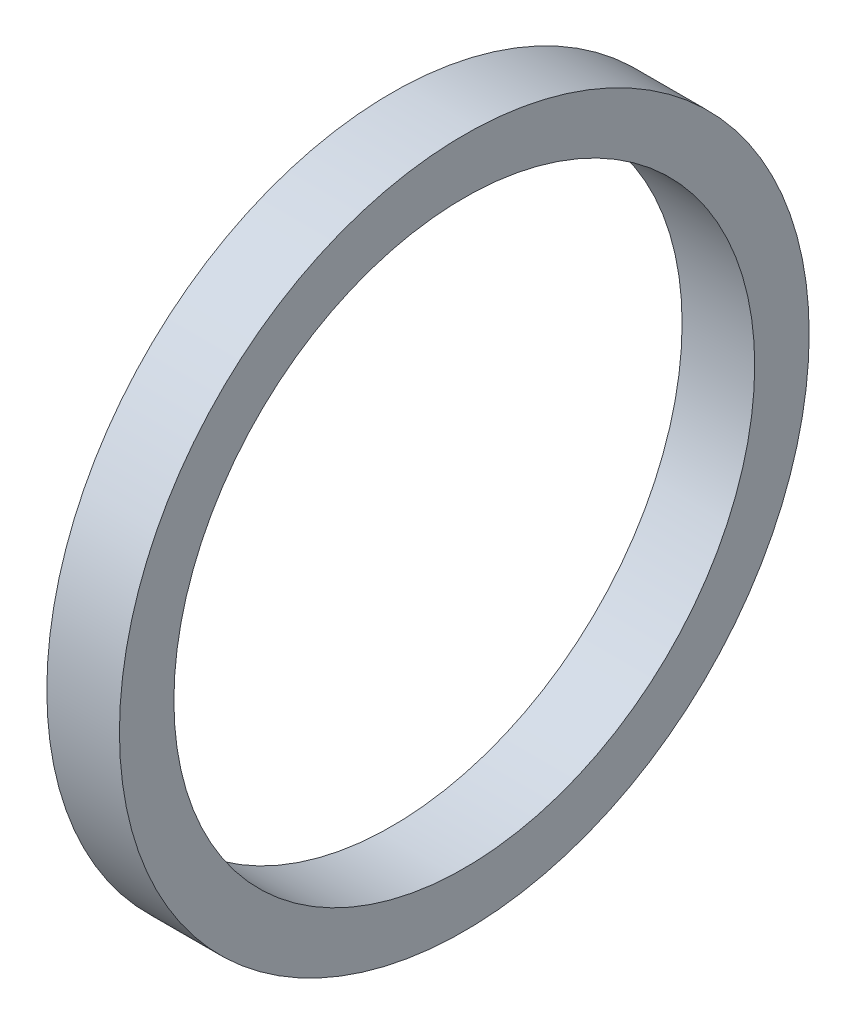
ISO-10303-21;
HEADER;
FILE_DESCRIPTION(('STEP AP214'),'2;1');
FILE_NAME('part.step','',(''),(''),'','','');
FILE_SCHEMA(('AUTOMOTIVE_DESIGN { 1 0 10303 214 1 1 1 1 }'));
ENDSEC;
DATA;
#1=APPLICATION_CONTEXT('core data for automotive mechanical design processes');
#2=APPLICATION_PROTOCOL_DEFINITION('international standard','automotive_design',2000,#1);
#3=PRODUCT_CONTEXT('',#1,'mechanical');
#4=PRODUCT('Part','Part','',(#3));
#5=PRODUCT_RELATED_PRODUCT_CATEGORY('part','',(#4));
#6=PRODUCT_DEFINITION_FORMATION('','',#4);
#7=PRODUCT_DEFINITION_CONTEXT('part definition',#1,'design');
#8=PRODUCT_DEFINITION('design','',#6,#7);
#9=PRODUCT_DEFINITION_SHAPE('','',#8);
#10=(LENGTH_UNIT() NAMED_UNIT(*) SI_UNIT(.MILLI.,.METRE.));
#11=(NAMED_UNIT(*) PLANE_ANGLE_UNIT() SI_UNIT($,.RADIAN.));
#12=(NAMED_UNIT(*) SI_UNIT($,.STERADIAN.) SOLID_ANGLE_UNIT());
#13=UNCERTAINTY_MEASURE_WITH_UNIT(LENGTH_MEASURE(1.E-05),#10,'distance_accuracy_value','');
#14=(GEOMETRIC_REPRESENTATION_CONTEXT(3) GLOBAL_UNCERTAINTY_ASSIGNED_CONTEXT((#13)) GLOBAL_UNIT_ASSIGNED_CONTEXT((#10,
#11,#12)) REPRESENTATION_CONTEXT('',''));
#15=CARTESIAN_POINT('',(0.,0.,0.));
#16=DIRECTION('',(0.,0.,1.));
#17=DIRECTION('',(1.,0.,0.));
#18=AXIS2_PLACEMENT_3D('',#15,#16,#17);
#19=CARTESIAN_POINT('',(1.,0.,0.));
#20=DIRECTION('',(1.,0.,0.));
#21=DIRECTION('',(0.,0.,-1.));
#22=AXIS2_PLACEMENT_3D('',#19,#20,#21);
#23=PLANE('',#22);
#24=CARTESIAN_POINT('',(1.,0.,0.));
#25=DIRECTION('',(1.,0.,0.));
#26=DIRECTION('',(0.,0.,-1.));
#27=AXIS2_PLACEMENT_3D('',#24,#25,#26);
#28=CIRCLE('',#27,4.75);
#29=CARTESIAN_POINT('',(1.,0.,-4.75));
#30=VERTEX_POINT('',#29);
#31=EDGE_CURVE('E10',#30,#30,#28,.T.);
#32=ORIENTED_EDGE('',*,*,#31,.T.);
#33=EDGE_LOOP('',(#32));
#34=FACE_BOUND('',#33,.T.);
#35=CARTESIAN_POINT('',(1.,0.,0.));
#36=DIRECTION('',(1.,0.,0.));
#37=DIRECTION('',(0.,0.,-1.));
#38=AXIS2_PLACEMENT_3D('',#35,#36,#37);
#39=CIRCLE('',#38,4.);
#40=CARTESIAN_POINT('',(1.,0.,-4.));
#41=VERTEX_POINT('',#40);
#42=EDGE_CURVE('E42',#41,#41,#39,.T.);
#43=ORIENTED_EDGE('',*,*,#42,.F.);
#44=EDGE_LOOP('',(#43));
#45=FACE_BOUND('',#44,.T.);
#46=ADVANCED_FACE('F31',(#34,#45),#23,.T.);
#47=CARTESIAN_POINT('',(0.,0.,0.));
#48=DIRECTION('',(1.,0.,0.));
#49=DIRECTION('',(0.,0.,-1.));
#50=AXIS2_PLACEMENT_3D('',#47,#48,#49);
#51=PLANE('',#50);
#52=CARTESIAN_POINT('',(0.,0.,0.));
#53=DIRECTION('',(1.,0.,0.));
#54=DIRECTION('',(0.,0.,-1.));
#55=AXIS2_PLACEMENT_3D('',#52,#53,#54);
#56=CIRCLE('',#55,4.75);
#57=CARTESIAN_POINT('',(0.,0.,-4.75));
#58=VERTEX_POINT('',#57);
#59=EDGE_CURVE('E35',#58,#58,#56,.T.);
#60=ORIENTED_EDGE('',*,*,#59,.F.);
#61=EDGE_LOOP('',(#60));
#62=FACE_BOUND('',#61,.T.);
#63=CARTESIAN_POINT('',(0.,0.,0.));
#64=DIRECTION('',(1.,0.,0.));
#65=DIRECTION('',(0.,0.,-1.));
#66=AXIS2_PLACEMENT_3D('',#63,#64,#65);
#67=CIRCLE('',#66,4.);
#68=CARTESIAN_POINT('',(0.,0.,-4.));
#69=VERTEX_POINT('',#68);
#70=EDGE_CURVE('E44',#69,#69,#67,.T.);
#71=ORIENTED_EDGE('',*,*,#70,.T.);
#72=EDGE_LOOP('',(#71));
#73=FACE_BOUND('',#72,.T.);
#74=ADVANCED_FACE('F54',(#62,#73),#51,.F.);
#75=CARTESIAN_POINT('',(1.,0.,0.));
#76=DIRECTION('',(-1.,0.,0.));
#77=DIRECTION('',(0.,0.,1.));
#78=AXIS2_PLACEMENT_3D('',#75,#76,#77);
#79=CYLINDRICAL_SURFACE('',#78,4.75);
#80=ORIENTED_EDGE('',*,*,#31,.F.);
#81=EDGE_LOOP('',(#80));
#82=FACE_BOUND('',#81,.T.);
#83=ORIENTED_EDGE('',*,*,#59,.T.);
#84=EDGE_LOOP('',(#83));
#85=FACE_BOUND('',#84,.T.);
#86=ADVANCED_FACE('F33',(#82,#85),#79,.T.);
#87=CARTESIAN_POINT('',(1.,0.,0.));
#88=DIRECTION('',(-1.,0.,0.));
#89=DIRECTION('',(0.,0.,1.));
#90=AXIS2_PLACEMENT_3D('',#87,#88,#89);
#91=CYLINDRICAL_SURFACE('',#90,4.);
#92=ORIENTED_EDGE('',*,*,#42,.T.);
#93=EDGE_LOOP('',(#92));
#94=FACE_BOUND('',#93,.T.);
#95=ORIENTED_EDGE('',*,*,#70,.F.);
#96=EDGE_LOOP('',(#95));
#97=FACE_BOUND('',#96,.T.);
#98=ADVANCED_FACE('F50',(#94,#97),#91,.F.);
#99=CLOSED_SHELL('',(#46,#74,#86,#98));
#100=MANIFOLD_SOLID_BREP('B2',#99);
#101=ADVANCED_BREP_SHAPE_REPRESENTATION('',(#18,#100),#14);
#102=SHAPE_DEFINITION_REPRESENTATION(#9,#101);
ENDSEC;
END-ISO-10303-21;
